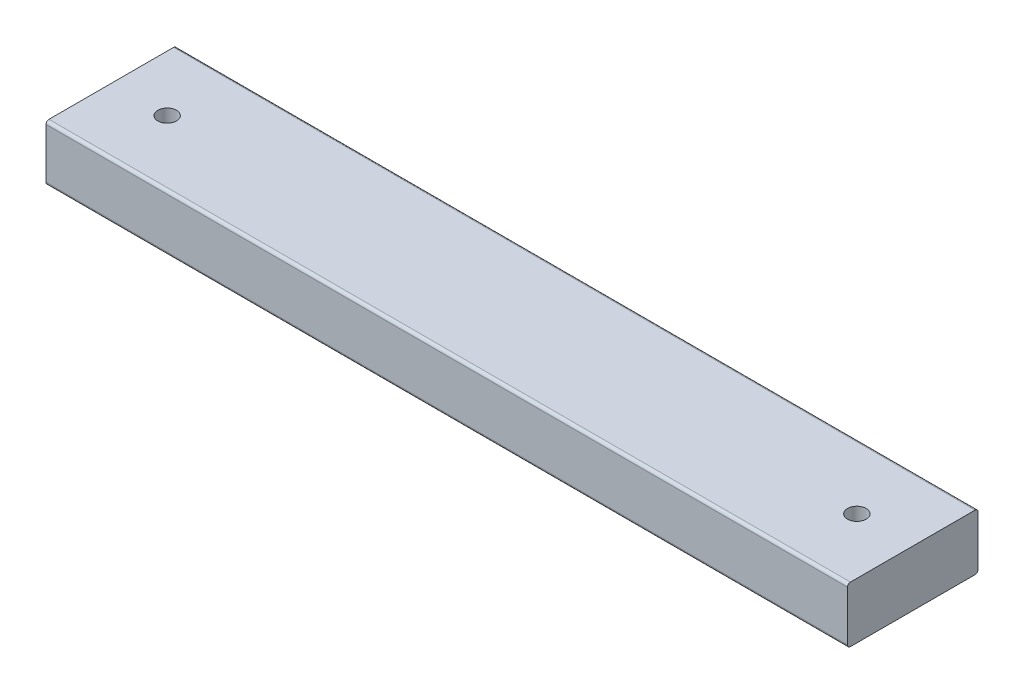
ISO-10303-21;
HEADER;
FILE_DESCRIPTION(('STEP AP214'),'2;1');
FILE_NAME('part.step','',(''),(''),'','','');
FILE_SCHEMA(('AUTOMOTIVE_DESIGN { 1 0 10303 214 1 1 1 1 }'));
ENDSEC;
DATA;
#1=APPLICATION_CONTEXT('core data for automotive mechanical design processes');
#2=APPLICATION_PROTOCOL_DEFINITION('international standard','automotive_design',2000,#1);
#3=PRODUCT_CONTEXT('',#1,'mechanical');
#4=PRODUCT('Part','Part','',(#3));
#5=PRODUCT_RELATED_PRODUCT_CATEGORY('part','',(#4));
#6=PRODUCT_DEFINITION_FORMATION('','',#4);
#7=PRODUCT_DEFINITION_CONTEXT('part definition',#1,'design');
#8=PRODUCT_DEFINITION('design','',#6,#7);
#9=PRODUCT_DEFINITION_SHAPE('','',#8);
#10=(LENGTH_UNIT() NAMED_UNIT(*) SI_UNIT(.MILLI.,.METRE.));
#11=(NAMED_UNIT(*) PLANE_ANGLE_UNIT() SI_UNIT($,.RADIAN.));
#12=(NAMED_UNIT(*) SI_UNIT($,.STERADIAN.) SOLID_ANGLE_UNIT());
#13=UNCERTAINTY_MEASURE_WITH_UNIT(LENGTH_MEASURE(1.E-05),#10,'distance_accuracy_value','');
#14=(GEOMETRIC_REPRESENTATION_CONTEXT(3) GLOBAL_UNCERTAINTY_ASSIGNED_CONTEXT((#13)) GLOBAL_UNIT_ASSIGNED_CONTEXT((#10,
#11,#12)) REPRESENTATION_CONTEXT('',''));
#15=CARTESIAN_POINT('',(0.,0.,0.));
#16=DIRECTION('',(0.,0.,1.));
#17=DIRECTION('',(1.,0.,0.));
#18=AXIS2_PLACEMENT_3D('',#15,#16,#17);
#19=CARTESIAN_POINT('',(546.1,-19.05,-44.45));
#20=DIRECTION('',(0.,0.,1.));
#21=DIRECTION('',(1.,0.,0.));
#22=AXIS2_PLACEMENT_3D('',#19,#20,#21);
#23=PLANE('',#22);
#24=DIRECTION('',(0.,1.,0.));
#25=VECTOR('',#24,1.);
#26=CARTESIAN_POINT('',(0.,-19.05,-44.45));
#27=LINE('',#26,#25);
#28=CARTESIAN_POINT('',(0.,-17.05,-44.45));
#29=VERTEX_POINT('',#28);
#30=CARTESIAN_POINT('',(0.,17.05,-44.45));
#31=VERTEX_POINT('',#30);
#32=EDGE_CURVE('E129',#29,#31,#27,.T.);
#33=ORIENTED_EDGE('',*,*,#32,.T.);
#34=DIRECTION('',(-1.,0.,0.));
#35=VECTOR('',#34,1.);
#36=CARTESIAN_POINT('',(546.1,17.05,-44.45));
#37=LINE('',#36,#35);
#38=CARTESIAN_POINT('',(546.1,17.05,-44.45));
#39=VERTEX_POINT('',#38);
#40=EDGE_CURVE('E152',#31,#39,#37,.F.);
#41=ORIENTED_EDGE('',*,*,#40,.T.);
#42=DIRECTION('',(0.,1.,0.));
#43=VECTOR('',#42,1.);
#44=CARTESIAN_POINT('',(546.1,-19.05,-44.45));
#45=LINE('',#44,#43);
#46=CARTESIAN_POINT('',(546.1,-17.05,-44.45));
#47=VERTEX_POINT('',#46);
#48=EDGE_CURVE('E127',#47,#39,#45,.T.);
#49=ORIENTED_EDGE('',*,*,#48,.F.);
#50=DIRECTION('',(-1.,0.,0.));
#51=VECTOR('',#50,1.);
#52=CARTESIAN_POINT('',(546.1,-17.05,-44.45));
#53=LINE('',#52,#51);
#54=EDGE_CURVE('E149',#47,#29,#53,.T.);
#55=ORIENTED_EDGE('',*,*,#54,.T.);
#56=EDGE_LOOP('',(#33,#41,#49,#55));
#57=FACE_BOUND('',#56,.T.);
#58=ADVANCED_FACE('F34',(#57),#23,.F.);
#59=CARTESIAN_POINT('',(546.1,19.05,44.45));
#60=DIRECTION('',(0.,-1.,0.));
#61=DIRECTION('',(0.,0.,-1.));
#62=AXIS2_PLACEMENT_3D('',#59,#60,#61);
#63=PLANE('',#62);
#64=CARTESIAN_POINT('',(38.1,19.05,0.));
#65=DIRECTION('',(0.,-1.,0.));
#66=DIRECTION('',(0.,0.,1.));
#67=AXIS2_PLACEMENT_3D('',#64,#65,#66);
#68=CIRCLE('',#67,6.34999999999994);
#69=CARTESIAN_POINT('',(38.1,19.05,6.34999999999991));
#70=VERTEX_POINT('',#69);
#71=EDGE_CURVE('E184',#70,#70,#68,.T.);
#72=ORIENTED_EDGE('',*,*,#71,.T.);
#73=EDGE_LOOP('',(#72));
#74=FACE_BOUND('',#73,.T.);
#75=CARTESIAN_POINT('',(508.,19.05,0.));
#76=DIRECTION('',(0.,1.,0.));
#77=DIRECTION('',(0.,0.,1.));
#78=AXIS2_PLACEMENT_3D('',#75,#76,#77);
#79=CIRCLE('',#78,6.34999999999994);
#80=CARTESIAN_POINT('',(508.,19.05,6.34999999999994));
#81=VERTEX_POINT('',#80);
#82=EDGE_CURVE('E173',#81,#81,#79,.T.);
#83=ORIENTED_EDGE('',*,*,#82,.F.);
#84=EDGE_LOOP('',(#83));
#85=FACE_BOUND('',#84,.T.);
#86=DIRECTION('',(0.,0.,1.));
#87=VECTOR('',#86,1.);
#88=CARTESIAN_POINT('',(0.,19.05,44.45));
#89=LINE('',#88,#87);
#90=CARTESIAN_POINT('',(0.,19.05,-42.45));
#91=VERTEX_POINT('',#90);
#92=CARTESIAN_POINT('',(0.,19.05,42.45));
#93=VERTEX_POINT('',#92);
#94=EDGE_CURVE('E125',#91,#93,#89,.T.);
#95=ORIENTED_EDGE('',*,*,#94,.T.);
#96=DIRECTION('',(-1.,0.,0.));
#97=VECTOR('',#96,1.);
#98=CARTESIAN_POINT('',(546.1,19.05,42.45));
#99=LINE('',#98,#97);
#100=CARTESIAN_POINT('',(546.1,19.05,42.45));
#101=VERTEX_POINT('',#100);
#102=EDGE_CURVE('E104',#93,#101,#99,.F.);
#103=ORIENTED_EDGE('',*,*,#102,.T.);
#104=DIRECTION('',(0.,0.,1.));
#105=VECTOR('',#104,1.);
#106=CARTESIAN_POINT('',(546.1,19.05,44.45));
#107=LINE('',#106,#105);
#108=CARTESIAN_POINT('',(546.1,19.05,-42.45));
#109=VERTEX_POINT('',#108);
#110=EDGE_CURVE('E168',#109,#101,#107,.T.);
#111=ORIENTED_EDGE('',*,*,#110,.F.);
#112=DIRECTION('',(-1.,0.,0.));
#113=VECTOR('',#112,1.);
#114=CARTESIAN_POINT('',(546.1,19.05,-42.45));
#115=LINE('',#114,#113);
#116=EDGE_CURVE('E109',#109,#91,#115,.T.);
#117=ORIENTED_EDGE('',*,*,#116,.T.);
#118=EDGE_LOOP('',(#95,#103,#111,#117));
#119=FACE_BOUND('',#118,.T.);
#120=ADVANCED_FACE('F201',(#74,#85,#119),#63,.F.);
#121=CARTESIAN_POINT('',(546.1,-19.05,44.45));
#122=DIRECTION('',(0.,0.,-1.));
#123=DIRECTION('',(-1.,0.,0.));
#124=AXIS2_PLACEMENT_3D('',#121,#122,#123);
#125=PLANE('',#124);
#126=DIRECTION('',(0.,-1.,0.));
#127=VECTOR('',#126,1.);
#128=CARTESIAN_POINT('',(546.1,-19.05,44.45));
#129=LINE('',#128,#127);
#130=CARTESIAN_POINT('',(546.1,17.05,44.45));
#131=VERTEX_POINT('',#130);
#132=CARTESIAN_POINT('',(546.1,-17.05,44.45));
#133=VERTEX_POINT('',#132);
#134=EDGE_CURVE('E118',#131,#133,#129,.T.);
#135=ORIENTED_EDGE('',*,*,#134,.F.);
#136=DIRECTION('',(-1.,0.,0.));
#137=VECTOR('',#136,1.);
#138=CARTESIAN_POINT('',(546.1,17.05,44.45));
#139=LINE('',#138,#137);
#140=CARTESIAN_POINT('',(0.,17.05,44.45));
#141=VERTEX_POINT('',#140);
#142=EDGE_CURVE('E103',#131,#141,#139,.T.);
#143=ORIENTED_EDGE('',*,*,#142,.T.);
#144=DIRECTION('',(0.,-1.,0.));
#145=VECTOR('',#144,1.);
#146=CARTESIAN_POINT('',(0.,-19.05,44.45));
#147=LINE('',#146,#145);
#148=CARTESIAN_POINT('',(0.,-17.05,44.45));
#149=VERTEX_POINT('',#148);
#150=EDGE_CURVE('E116',#141,#149,#147,.T.);
#151=ORIENTED_EDGE('',*,*,#150,.T.);
#152=DIRECTION('',(-1.,0.,0.));
#153=VECTOR('',#152,1.);
#154=CARTESIAN_POINT('',(546.1,-17.05,44.45));
#155=LINE('',#154,#153);
#156=EDGE_CURVE('E120',#149,#133,#155,.F.);
#157=ORIENTED_EDGE('',*,*,#156,.T.);
#158=EDGE_LOOP('',(#135,#143,#151,#157));
#159=FACE_BOUND('',#158,.T.);
#160=ADVANCED_FACE('F115',(#159),#125,.F.);
#161=CARTESIAN_POINT('',(546.1,-19.05,44.45));
#162=DIRECTION('',(0.,1.,0.));
#163=DIRECTION('',(0.,0.,1.));
#164=AXIS2_PLACEMENT_3D('',#161,#162,#163);
#165=PLANE('',#164);
#166=CARTESIAN_POINT('',(38.1,-19.05,0.));
#167=DIRECTION('',(0.,-1.,0.));
#168=DIRECTION('',(0.,0.,1.));
#169=AXIS2_PLACEMENT_3D('',#166,#167,#168);
#170=CIRCLE('',#169,6.34999999999994);
#171=CARTESIAN_POINT('',(38.1,-19.05,6.34999999999991));
#172=VERTEX_POINT('',#171);
#173=EDGE_CURVE('E182',#172,#172,#170,.T.);
#174=ORIENTED_EDGE('',*,*,#173,.F.);
#175=EDGE_LOOP('',(#174));
#176=FACE_BOUND('',#175,.T.);
#177=CARTESIAN_POINT('',(508.,-19.05,0.));
#178=DIRECTION('',(0.,1.,0.));
#179=DIRECTION('',(0.,0.,1.));
#180=AXIS2_PLACEMENT_3D('',#177,#178,#179);
#181=CIRCLE('',#180,6.34999999999994);
#182=CARTESIAN_POINT('',(508.,-19.05,6.34999999999994));
#183=VERTEX_POINT('',#182);
#184=EDGE_CURVE('E177',#183,#183,#181,.T.);
#185=ORIENTED_EDGE('',*,*,#184,.T.);
#186=EDGE_LOOP('',(#185));
#187=FACE_BOUND('',#186,.T.);
#188=DIRECTION('',(0.,0.,-1.));
#189=VECTOR('',#188,1.);
#190=CARTESIAN_POINT('',(0.,-19.05,44.45));
#191=LINE('',#190,#189);
#192=CARTESIAN_POINT('',(0.,-19.05,42.45));
#193=VERTEX_POINT('',#192);
#194=CARTESIAN_POINT('',(0.,-19.05,-42.45));
#195=VERTEX_POINT('',#194);
#196=EDGE_CURVE('E124',#193,#195,#191,.T.);
#197=ORIENTED_EDGE('',*,*,#196,.T.);
#198=DIRECTION('',(-1.,0.,0.));
#199=VECTOR('',#198,1.);
#200=CARTESIAN_POINT('',(546.1,-19.05,-42.45));
#201=LINE('',#200,#199);
#202=CARTESIAN_POINT('',(546.1,-19.05,-42.45));
#203=VERTEX_POINT('',#202);
#204=EDGE_CURVE('E11',#195,#203,#201,.F.);
#205=ORIENTED_EDGE('',*,*,#204,.T.);
#206=DIRECTION('',(0.,0.,-1.));
#207=VECTOR('',#206,1.);
#208=CARTESIAN_POINT('',(546.1,-19.05,44.45));
#209=LINE('',#208,#207);
#210=CARTESIAN_POINT('',(546.1,-19.05,42.45));
#211=VERTEX_POINT('',#210);
#212=EDGE_CURVE('E133',#211,#203,#209,.T.);
#213=ORIENTED_EDGE('',*,*,#212,.F.);
#214=DIRECTION('',(-1.,0.,0.));
#215=VECTOR('',#214,1.);
#216=CARTESIAN_POINT('',(546.1,-19.05,42.45));
#217=LINE('',#216,#215);
#218=EDGE_CURVE('E42',#211,#193,#217,.T.);
#219=ORIENTED_EDGE('',*,*,#218,.T.);
#220=EDGE_LOOP('',(#197,#205,#213,#219));
#221=FACE_BOUND('',#220,.T.);
#222=ADVANCED_FACE('F155',(#176,#187,#221),#165,.F.);
#223=CARTESIAN_POINT('',(546.1,0.,0.));
#224=DIRECTION('',(-1.,0.,0.));
#225=DIRECTION('',(0.,0.,1.));
#226=AXIS2_PLACEMENT_3D('',#223,#224,#225);
#227=PLANE('',#226);
#228=ORIENTED_EDGE('',*,*,#110,.T.);
#229=CARTESIAN_POINT('',(546.1,17.05,42.45));
#230=DIRECTION('',(-1.,0.,0.));
#231=DIRECTION('',(0.,0.,1.));
#232=AXIS2_PLACEMENT_3D('',#229,#230,#231);
#233=CIRCLE('',#232,2.);
#234=EDGE_CURVE('E147',#101,#131,#233,.F.);
#235=ORIENTED_EDGE('',*,*,#234,.T.);
#236=ORIENTED_EDGE('',*,*,#134,.T.);
#237=CARTESIAN_POINT('',(546.1,-17.05,42.45));
#238=DIRECTION('',(-1.,0.,0.));
#239=DIRECTION('',(0.,0.,1.));
#240=AXIS2_PLACEMENT_3D('',#237,#238,#239);
#241=CIRCLE('',#240,2.);
#242=EDGE_CURVE('E54',#133,#211,#241,.F.);
#243=ORIENTED_EDGE('',*,*,#242,.T.);
#244=ORIENTED_EDGE('',*,*,#212,.T.);
#245=CARTESIAN_POINT('',(546.1,-17.05,-42.45));
#246=DIRECTION('',(-1.,0.,0.));
#247=DIRECTION('',(0.,0.,1.));
#248=AXIS2_PLACEMENT_3D('',#245,#246,#247);
#249=CIRCLE('',#248,2.);
#250=EDGE_CURVE('E143',#203,#47,#249,.F.);
#251=ORIENTED_EDGE('',*,*,#250,.T.);
#252=ORIENTED_EDGE('',*,*,#48,.T.);
#253=CARTESIAN_POINT('',(546.1,17.05,-42.45));
#254=DIRECTION('',(-1.,0.,0.));
#255=DIRECTION('',(0.,0.,1.));
#256=AXIS2_PLACEMENT_3D('',#253,#254,#255);
#257=CIRCLE('',#256,2.);
#258=EDGE_CURVE('E145',#39,#109,#257,.F.);
#259=ORIENTED_EDGE('',*,*,#258,.T.);
#260=EDGE_LOOP('',(#228,#235,#236,#243,#244,#251,#252,#259));
#261=FACE_BOUND('',#260,.T.);
#262=ADVANCED_FACE('F194',(#261),#227,.F.);
#263=CARTESIAN_POINT('',(0.,0.,0.));
#264=DIRECTION('',(-1.,0.,0.));
#265=DIRECTION('',(0.,0.,1.));
#266=AXIS2_PLACEMENT_3D('',#263,#264,#265);
#267=PLANE('',#266);
#268=ORIENTED_EDGE('',*,*,#150,.F.);
#269=CARTESIAN_POINT('',(0.,17.05,42.45));
#270=DIRECTION('',(-1.,0.,0.));
#271=DIRECTION('',(0.,0.,1.));
#272=AXIS2_PLACEMENT_3D('',#269,#270,#271);
#273=CIRCLE('',#272,2.);
#274=EDGE_CURVE('E99',#141,#93,#273,.T.);
#275=ORIENTED_EDGE('',*,*,#274,.T.);
#276=ORIENTED_EDGE('',*,*,#94,.F.);
#277=CARTESIAN_POINT('',(0.,17.05,-42.45));
#278=DIRECTION('',(-1.,0.,0.));
#279=DIRECTION('',(0.,0.,1.));
#280=AXIS2_PLACEMENT_3D('',#277,#278,#279);
#281=CIRCLE('',#280,2.);
#282=EDGE_CURVE('E110',#91,#31,#281,.T.);
#283=ORIENTED_EDGE('',*,*,#282,.T.);
#284=ORIENTED_EDGE('',*,*,#32,.F.);
#285=CARTESIAN_POINT('',(0.,-17.05,-42.45));
#286=DIRECTION('',(-1.,0.,0.));
#287=DIRECTION('',(0.,0.,1.));
#288=AXIS2_PLACEMENT_3D('',#285,#286,#287);
#289=CIRCLE('',#288,2.);
#290=EDGE_CURVE('E136',#29,#195,#289,.T.);
#291=ORIENTED_EDGE('',*,*,#290,.T.);
#292=ORIENTED_EDGE('',*,*,#196,.F.);
#293=CARTESIAN_POINT('',(0.,-17.05,42.45));
#294=DIRECTION('',(-1.,0.,0.));
#295=DIRECTION('',(0.,0.,1.));
#296=AXIS2_PLACEMENT_3D('',#293,#294,#295);
#297=CIRCLE('',#296,2.);
#298=EDGE_CURVE('E119',#193,#149,#297,.T.);
#299=ORIENTED_EDGE('',*,*,#298,.T.);
#300=EDGE_LOOP('',(#268,#275,#276,#283,#284,#291,#292,#299));
#301=FACE_BOUND('',#300,.T.);
#302=ADVANCED_FACE('F122',(#301),#267,.T.);
#303=CARTESIAN_POINT('',(546.1,17.05,42.45));
#304=DIRECTION('',(-1.,0.,0.));
#305=DIRECTION('',(0.,0.,1.));
#306=AXIS2_PLACEMENT_3D('',#303,#304,#305);
#307=CYLINDRICAL_SURFACE('',#306,2.);
#308=ORIENTED_EDGE('',*,*,#234,.F.);
#309=ORIENTED_EDGE('',*,*,#102,.F.);
#310=ORIENTED_EDGE('',*,*,#274,.F.);
#311=ORIENTED_EDGE('',*,*,#142,.F.);
#312=EDGE_LOOP('',(#308,#309,#310,#311));
#313=FACE_BOUND('',#312,.T.);
#314=ADVANCED_FACE('F102',(#313),#307,.T.);
#315=CARTESIAN_POINT('',(546.1,17.05,-42.45));
#316=DIRECTION('',(-1.,0.,0.));
#317=DIRECTION('',(0.,0.,1.));
#318=AXIS2_PLACEMENT_3D('',#315,#316,#317);
#319=CYLINDRICAL_SURFACE('',#318,2.);
#320=ORIENTED_EDGE('',*,*,#258,.F.);
#321=ORIENTED_EDGE('',*,*,#40,.F.);
#322=ORIENTED_EDGE('',*,*,#282,.F.);
#323=ORIENTED_EDGE('',*,*,#116,.F.);
#324=EDGE_LOOP('',(#320,#321,#322,#323));
#325=FACE_BOUND('',#324,.T.);
#326=ADVANCED_FACE('F214',(#325),#319,.T.);
#327=CARTESIAN_POINT('',(546.1,-17.05,-42.45));
#328=DIRECTION('',(-1.,0.,0.));
#329=DIRECTION('',(0.,0.,1.));
#330=AXIS2_PLACEMENT_3D('',#327,#328,#329);
#331=CYLINDRICAL_SURFACE('',#330,2.);
#332=ORIENTED_EDGE('',*,*,#250,.F.);
#333=ORIENTED_EDGE('',*,*,#204,.F.);
#334=ORIENTED_EDGE('',*,*,#290,.F.);
#335=ORIENTED_EDGE('',*,*,#54,.F.);
#336=EDGE_LOOP('',(#332,#333,#334,#335));
#337=FACE_BOUND('',#336,.T.);
#338=ADVANCED_FACE('F162',(#337),#331,.T.);
#339=CARTESIAN_POINT('',(546.1,-17.05,42.45));
#340=DIRECTION('',(-1.,0.,0.));
#341=DIRECTION('',(0.,0.,1.));
#342=AXIS2_PLACEMENT_3D('',#339,#340,#341);
#343=CYLINDRICAL_SURFACE('',#342,2.);
#344=ORIENTED_EDGE('',*,*,#242,.F.);
#345=ORIENTED_EDGE('',*,*,#156,.F.);
#346=ORIENTED_EDGE('',*,*,#298,.F.);
#347=ORIENTED_EDGE('',*,*,#218,.F.);
#348=EDGE_LOOP('',(#344,#345,#346,#347));
#349=FACE_BOUND('',#348,.T.);
#350=ADVANCED_FACE('F36',(#349),#343,.T.);
#351=CARTESIAN_POINT('',(508.,-19.05,0.));
#352=DIRECTION('',(0.,1.,0.));
#353=DIRECTION('',(0.,0.,1.));
#354=AXIS2_PLACEMENT_3D('',#351,#352,#353);
#355=CYLINDRICAL_SURFACE('',#354,6.34999999999994);
#356=ORIENTED_EDGE('',*,*,#184,.F.);
#357=EDGE_LOOP('',(#356));
#358=FACE_BOUND('',#357,.T.);
#359=ORIENTED_EDGE('',*,*,#82,.T.);
#360=EDGE_LOOP('',(#359));
#361=FACE_BOUND('',#360,.T.);
#362=ADVANCED_FACE('F221',(#358,#361),#355,.F.);
#363=CARTESIAN_POINT('',(38.1,-19.05,0.));
#364=DIRECTION('',(0.,1.,0.));
#365=DIRECTION('',(0.,0.,1.));
#366=AXIS2_PLACEMENT_3D('',#363,#364,#365);
#367=CYLINDRICAL_SURFACE('',#366,6.34999999999994);
#368=ORIENTED_EDGE('',*,*,#173,.T.);
#369=EDGE_LOOP('',(#368));
#370=FACE_BOUND('',#369,.T.);
#371=ORIENTED_EDGE('',*,*,#71,.F.);
#372=EDGE_LOOP('',(#371));
#373=FACE_BOUND('',#372,.T.);
#374=ADVANCED_FACE('F190',(#370,#373),#367,.F.);
#375=CLOSED_SHELL('',(#58,#120,#160,#222,#262,#302,#314,#326,#338,#350,#362,#374));
#376=MANIFOLD_SOLID_BREP('B2',#375);
#377=ADVANCED_BREP_SHAPE_REPRESENTATION('',(#18,#376),#14);
#378=SHAPE_DEFINITION_REPRESENTATION(#9,#377);
ENDSEC;
END-ISO-10303-21;
